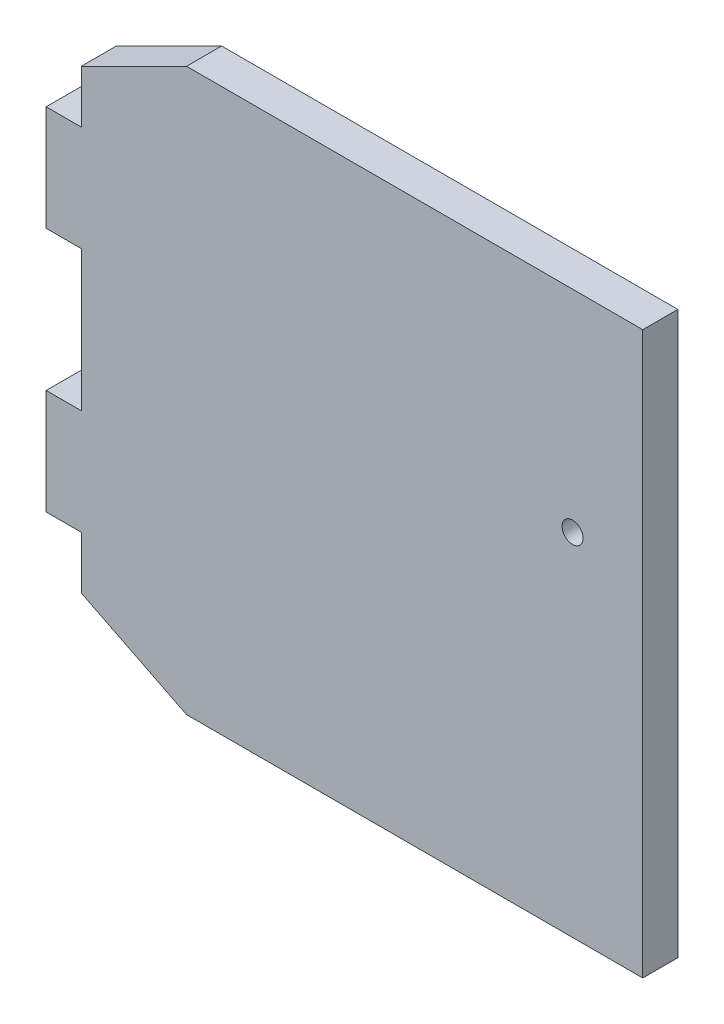
ISO-10303-21;
HEADER;
FILE_DESCRIPTION(('STEP AP214'),'2;1');
FILE_NAME('part.step','',(''),(''),'','','');
FILE_SCHEMA(('AUTOMOTIVE_DESIGN { 1 0 10303 214 1 1 1 1 }'));
ENDSEC;
DATA;
#1=APPLICATION_CONTEXT('core data for automotive mechanical design processes');
#2=APPLICATION_PROTOCOL_DEFINITION('international standard','automotive_design',2000,#1);
#3=PRODUCT_CONTEXT('',#1,'mechanical');
#4=PRODUCT('Part','Part','',(#3));
#5=PRODUCT_RELATED_PRODUCT_CATEGORY('part','',(#4));
#6=PRODUCT_DEFINITION_FORMATION('','',#4);
#7=PRODUCT_DEFINITION_CONTEXT('part definition',#1,'design');
#8=PRODUCT_DEFINITION('design','',#6,#7);
#9=PRODUCT_DEFINITION_SHAPE('','',#8);
#10=(LENGTH_UNIT() NAMED_UNIT(*) SI_UNIT(.MILLI.,.METRE.));
#11=(NAMED_UNIT(*) PLANE_ANGLE_UNIT() SI_UNIT($,.RADIAN.));
#12=(NAMED_UNIT(*) SI_UNIT($,.STERADIAN.) SOLID_ANGLE_UNIT());
#13=UNCERTAINTY_MEASURE_WITH_UNIT(LENGTH_MEASURE(1.E-05),#10,'distance_accuracy_value','');
#14=(GEOMETRIC_REPRESENTATION_CONTEXT(3) GLOBAL_UNCERTAINTY_ASSIGNED_CONTEXT((#13)) GLOBAL_UNIT_ASSIGNED_CONTEXT((#10,
#11,#12)) REPRESENTATION_CONTEXT('',''));
#15=CARTESIAN_POINT('',(0.,0.,0.));
#16=DIRECTION('',(0.,0.,1.));
#17=DIRECTION('',(1.,0.,0.));
#18=AXIS2_PLACEMENT_3D('',#15,#16,#17);
#19=CARTESIAN_POINT('',(-40.,31.7837837837838,5.));
#20=DIRECTION('',(1.,0.,0.));
#21=DIRECTION('',(0.,0.,-1.));
#22=AXIS2_PLACEMENT_3D('',#19,#20,#21);
#23=PLANE('',#22);
#24=DIRECTION('',(0.,-1.,0.));
#25=VECTOR('',#24,1.);
#26=CARTESIAN_POINT('',(-40.,31.7837837837838,0.));
#27=LINE('',#26,#25);
#28=CARTESIAN_POINT('',(-40.,-33.2162162162162,0.));
#29=VERTEX_POINT('',#28);
#30=CARTESIAN_POINT('',(-40.,-40.7162162162162,0.));
#31=VERTEX_POINT('',#30);
#32=EDGE_CURVE('E166',#29,#31,#27,.T.);
#33=ORIENTED_EDGE('',*,*,#32,.T.);
#34=DIRECTION('',(0.,0.,1.));
#35=VECTOR('',#34,1.);
#36=CARTESIAN_POINT('',(-40.,-40.7162162162162,0.));
#37=LINE('',#36,#35);
#38=CARTESIAN_POINT('',(-40.,-40.7162162162162,5.));
#39=VERTEX_POINT('',#38);
#40=EDGE_CURVE('E55',#31,#39,#37,.T.);
#41=ORIENTED_EDGE('',*,*,#40,.T.);
#42=DIRECTION('',(0.,-1.,0.));
#43=VECTOR('',#42,1.);
#44=CARTESIAN_POINT('',(-40.,31.7837837837838,5.));
#45=LINE('',#44,#43);
#46=CARTESIAN_POINT('',(-40.,-33.2162162162162,5.));
#47=VERTEX_POINT('',#46);
#48=EDGE_CURVE('E194',#47,#39,#45,.T.);
#49=ORIENTED_EDGE('',*,*,#48,.F.);
#50=DIRECTION('',(0.,0.,1.));
#51=VECTOR('',#50,1.);
#52=CARTESIAN_POINT('',(-40.,-33.2162162162162,0.));
#53=LINE('',#52,#51);
#54=EDGE_CURVE('E222',#29,#47,#53,.T.);
#55=ORIENTED_EDGE('',*,*,#54,.F.);
#56=EDGE_LOOP('',(#33,#41,#49,#55));
#57=FACE_BOUND('',#56,.T.);
#58=ADVANCED_FACE('F39',(#57),#23,.F.);
#59=DIRECTION('',(0.,0.,-1.));
#60=VECTOR('',#59,1.);
#61=CARTESIAN_POINT('',(-40.,-18.2162162162162,0.));
#62=LINE('',#61,#60);
#63=CARTESIAN_POINT('',(-40.,-18.2162162162162,5.));
#64=VERTEX_POINT('',#63);
#65=CARTESIAN_POINT('',(-40.,-18.2162162162162,0.));
#66=VERTEX_POINT('',#65);
#67=EDGE_CURVE('E226',#64,#66,#62,.T.);
#68=ORIENTED_EDGE('',*,*,#67,.F.);
#69=CARTESIAN_POINT('',(-40.,1.7837837837838,5.));
#70=VERTEX_POINT('',#69);
#71=EDGE_CURVE('E193',#70,#64,#45,.T.);
#72=ORIENTED_EDGE('',*,*,#71,.F.);
#73=DIRECTION('',(0.,0.,1.));
#74=VECTOR('',#73,1.);
#75=CARTESIAN_POINT('',(-40.,1.7837837837838,0.));
#76=LINE('',#75,#74);
#77=CARTESIAN_POINT('',(-40.,1.7837837837838,0.));
#78=VERTEX_POINT('',#77);
#79=EDGE_CURVE('E274',#78,#70,#76,.T.);
#80=ORIENTED_EDGE('',*,*,#79,.F.);
#81=EDGE_CURVE('E164',#78,#66,#27,.T.);
#82=ORIENTED_EDGE('',*,*,#81,.T.);
#83=EDGE_LOOP('',(#68,#72,#80,#82));
#84=FACE_BOUND('',#83,.T.);
#85=ADVANCED_FACE('F326',(#84),#23,.F.);
#86=CARTESIAN_POINT('',(-40.,24.2837837837838,5.));
#87=VERTEX_POINT('',#86);
#88=CARTESIAN_POINT('',(-40.,16.7837837837838,5.));
#89=VERTEX_POINT('',#88);
#90=EDGE_CURVE('E154',#87,#89,#45,.T.);
#91=ORIENTED_EDGE('',*,*,#90,.F.);
#92=DIRECTION('',(0.,0.,1.));
#93=VECTOR('',#92,1.);
#94=CARTESIAN_POINT('',(-40.,24.2837837837838,0.));
#95=LINE('',#94,#93);
#96=CARTESIAN_POINT('',(-40.,24.2837837837838,0.));
#97=VERTEX_POINT('',#96);
#98=EDGE_CURVE('E141',#97,#87,#95,.T.);
#99=ORIENTED_EDGE('',*,*,#98,.F.);
#100=CARTESIAN_POINT('',(-40.,16.7837837837838,0.));
#101=VERTEX_POINT('',#100);
#102=EDGE_CURVE('E152',#97,#101,#27,.T.);
#103=ORIENTED_EDGE('',*,*,#102,.T.);
#104=DIRECTION('',(0.,0.,-1.));
#105=VECTOR('',#104,1.);
#106=CARTESIAN_POINT('',(-40.,16.7837837837838,0.));
#107=LINE('',#106,#105);
#108=EDGE_CURVE('E280',#89,#101,#107,.T.);
#109=ORIENTED_EDGE('',*,*,#108,.F.);
#110=EDGE_LOOP('',(#91,#99,#103,#109));
#111=FACE_BOUND('',#110,.T.);
#112=ADVANCED_FACE('F41',(#111),#23,.F.);
#113=CARTESIAN_POINT('',(-40.,-48.2162162162162,5.));
#114=DIRECTION('',(0.,1.,0.));
#115=DIRECTION('',(0.,0.,1.));
#116=AXIS2_PLACEMENT_3D('',#113,#114,#115);
#117=PLANE('',#116);
#118=DIRECTION('',(1.,0.,0.));
#119=VECTOR('',#118,1.);
#120=CARTESIAN_POINT('',(-40.,-48.2162162162162,5.));
#121=LINE('',#120,#119);
#122=CARTESIAN_POINT('',(-25.,-48.2162162162162,5.));
#123=VERTEX_POINT('',#122);
#124=CARTESIAN_POINT('',(40.,-48.2162162162162,5.));
#125=VERTEX_POINT('',#124);
#126=EDGE_CURVE('E192',#123,#125,#121,.T.);
#127=ORIENTED_EDGE('',*,*,#126,.F.);
#128=DIRECTION('',(0.,0.,1.));
#129=VECTOR('',#128,1.);
#130=CARTESIAN_POINT('',(-25.,-48.2162162162162,0.));
#131=LINE('',#130,#129);
#132=CARTESIAN_POINT('',(-25.,-48.2162162162162,0.));
#133=VERTEX_POINT('',#132);
#134=EDGE_CURVE('E233',#133,#123,#131,.T.);
#135=ORIENTED_EDGE('',*,*,#134,.F.);
#136=DIRECTION('',(1.,0.,0.));
#137=VECTOR('',#136,1.);
#138=CARTESIAN_POINT('',(-40.,-48.2162162162162,0.));
#139=LINE('',#138,#137);
#140=CARTESIAN_POINT('',(40.,-48.2162162162162,0.));
#141=VERTEX_POINT('',#140);
#142=EDGE_CURVE('E163',#133,#141,#139,.T.);
#143=ORIENTED_EDGE('',*,*,#142,.T.);
#144=DIRECTION('',(0.,0.,-1.));
#145=VECTOR('',#144,1.);
#146=CARTESIAN_POINT('',(40.,-48.2162162162162,5.));
#147=LINE('',#146,#145);
#148=EDGE_CURVE('E11',#125,#141,#147,.T.);
#149=ORIENTED_EDGE('',*,*,#148,.F.);
#150=EDGE_LOOP('',(#127,#135,#143,#149));
#151=FACE_BOUND('',#150,.T.);
#152=ADVANCED_FACE('F332',(#151),#117,.F.);
#153=CARTESIAN_POINT('',(40.,21.7837837837838,5.));
#154=DIRECTION('',(-1.,0.,0.));
#155=DIRECTION('',(0.,-1.,0.));
#156=AXIS2_PLACEMENT_3D('',#153,#154,#155);
#157=PLANE('',#156);
#158=DIRECTION('',(0.,1.,0.));
#159=VECTOR('',#158,1.);
#160=CARTESIAN_POINT('',(40.,21.7837837837838,0.));
#161=LINE('',#160,#159);
#162=CARTESIAN_POINT('',(40.,31.7837837837838,0.));
#163=VERTEX_POINT('',#162);
#164=EDGE_CURVE('E169',#141,#163,#161,.T.);
#165=ORIENTED_EDGE('',*,*,#164,.T.);
#166=DIRECTION('',(0.,0.,-1.));
#167=VECTOR('',#166,1.);
#168=CARTESIAN_POINT('',(40.,31.7837837837838,5.));
#169=LINE('',#168,#167);
#170=CARTESIAN_POINT('',(40.,31.7837837837838,5.));
#171=VERTEX_POINT('',#170);
#172=EDGE_CURVE('E48',#171,#163,#169,.T.);
#173=ORIENTED_EDGE('',*,*,#172,.F.);
#174=DIRECTION('',(0.,1.,0.));
#175=VECTOR('',#174,1.);
#176=CARTESIAN_POINT('',(40.,21.7837837837838,5.));
#177=LINE('',#176,#175);
#178=EDGE_CURVE('E197',#125,#171,#177,.T.);
#179=ORIENTED_EDGE('',*,*,#178,.F.);
#180=ORIENTED_EDGE('',*,*,#148,.T.);
#181=EDGE_LOOP('',(#165,#173,#179,#180));
#182=FACE_BOUND('',#181,.T.);
#183=ADVANCED_FACE('F216',(#182),#157,.F.);
#184=CARTESIAN_POINT('',(-40.,31.7837837837838,5.));
#185=DIRECTION('',(0.,-1.,0.));
#186=DIRECTION('',(0.,0.,-1.));
#187=AXIS2_PLACEMENT_3D('',#184,#185,#186);
#188=PLANE('',#187);
#189=DIRECTION('',(-1.,0.,0.));
#190=VECTOR('',#189,1.);
#191=CARTESIAN_POINT('',(-40.,31.7837837837838,0.));
#192=LINE('',#191,#190);
#193=CARTESIAN_POINT('',(-25.,31.7837837837838,0.));
#194=VERTEX_POINT('',#193);
#195=EDGE_CURVE('E209',#163,#194,#192,.T.);
#196=ORIENTED_EDGE('',*,*,#195,.T.);
#197=DIRECTION('',(0.,0.,1.));
#198=VECTOR('',#197,1.);
#199=CARTESIAN_POINT('',(-25.,31.7837837837838,0.));
#200=LINE('',#199,#198);
#201=CARTESIAN_POINT('',(-25.,31.7837837837838,5.));
#202=VERTEX_POINT('',#201);
#203=EDGE_CURVE('E63',#194,#202,#200,.T.);
#204=ORIENTED_EDGE('',*,*,#203,.T.);
#205=DIRECTION('',(-1.,0.,0.));
#206=VECTOR('',#205,1.);
#207=CARTESIAN_POINT('',(40.,31.7837837837838,5.));
#208=LINE('',#207,#206);
#209=EDGE_CURVE('E199',#171,#202,#208,.T.);
#210=ORIENTED_EDGE('',*,*,#209,.F.);
#211=ORIENTED_EDGE('',*,*,#172,.T.);
#212=EDGE_LOOP('',(#196,#204,#210,#211));
#213=FACE_BOUND('',#212,.T.);
#214=ADVANCED_FACE('F220',(#213),#188,.F.);
#215=CARTESIAN_POINT('',(0.,0.,5.));
#216=DIRECTION('',(0.,0.,1.));
#217=DIRECTION('',(1.,0.,0.));
#218=AXIS2_PLACEMENT_3D('',#215,#216,#217);
#219=PLANE('',#218);
#220=CARTESIAN_POINT('',(30.,1.7837837837838,5.));
#221=DIRECTION('',(0.,0.,1.));
#222=DIRECTION('',(1.,0.,0.));
#223=AXIS2_PLACEMENT_3D('',#220,#221,#222);
#224=CIRCLE('',#223,1.5);
#225=CARTESIAN_POINT('',(31.5,1.7837837837838,5.));
#226=VERTEX_POINT('',#225);
#227=EDGE_CURVE('E306',#226,#226,#224,.T.);
#228=ORIENTED_EDGE('',*,*,#227,.F.);
#229=EDGE_LOOP('',(#228));
#230=FACE_BOUND('',#229,.T.);
#231=DIRECTION('',(0.894427190999916,0.447213595499958,0.));
#232=VECTOR('',#231,1.);
#233=CARTESIAN_POINT('',(-25.,31.7837837837838,5.));
#234=LINE('',#233,#232);
#235=EDGE_CURVE('E147',#87,#202,#234,.T.);
#236=ORIENTED_EDGE('',*,*,#235,.F.);
#237=ORIENTED_EDGE('',*,*,#90,.T.);
#238=DIRECTION('',(1.,0.,0.));
#239=VECTOR('',#238,1.);
#240=CARTESIAN_POINT('',(-45.,16.7837837837838,5.));
#241=LINE('',#240,#239);
#242=CARTESIAN_POINT('',(-45.,16.7837837837838,5.));
#243=VERTEX_POINT('',#242);
#244=EDGE_CURVE('E186',#243,#89,#241,.T.);
#245=ORIENTED_EDGE('',*,*,#244,.F.);
#246=DIRECTION('',(0.,1.,0.));
#247=VECTOR('',#246,1.);
#248=CARTESIAN_POINT('',(-45.,16.7837837837838,5.));
#249=LINE('',#248,#247);
#250=CARTESIAN_POINT('',(-45.,1.7837837837838,5.));
#251=VERTEX_POINT('',#250);
#252=EDGE_CURVE('E283',#251,#243,#249,.T.);
#253=ORIENTED_EDGE('',*,*,#252,.F.);
#254=DIRECTION('',(1.,0.,0.));
#255=VECTOR('',#254,1.);
#256=CARTESIAN_POINT('',(-45.,1.7837837837838,5.));
#257=LINE('',#256,#255);
#258=EDGE_CURVE('E179',#251,#70,#257,.T.);
#259=ORIENTED_EDGE('',*,*,#258,.T.);
#260=ORIENTED_EDGE('',*,*,#71,.T.);
#261=DIRECTION('',(1.,0.,0.));
#262=VECTOR('',#261,1.);
#263=CARTESIAN_POINT('',(-45.,-18.2162162162162,5.));
#264=LINE('',#263,#262);
#265=CARTESIAN_POINT('',(-45.,-18.2162162162162,5.));
#266=VERTEX_POINT('',#265);
#267=EDGE_CURVE('E262',#266,#64,#264,.T.);
#268=ORIENTED_EDGE('',*,*,#267,.F.);
#269=DIRECTION('',(0.,1.,0.));
#270=VECTOR('',#269,1.);
#271=CARTESIAN_POINT('',(-45.,-18.2162162162162,5.));
#272=LINE('',#271,#270);
#273=CARTESIAN_POINT('',(-45.,-33.2162162162162,5.));
#274=VERTEX_POINT('',#273);
#275=EDGE_CURVE('E249',#274,#266,#272,.T.);
#276=ORIENTED_EDGE('',*,*,#275,.F.);
#277=DIRECTION('',(1.,0.,0.));
#278=VECTOR('',#277,1.);
#279=CARTESIAN_POINT('',(-45.,-33.2162162162162,5.));
#280=LINE('',#279,#278);
#281=EDGE_CURVE('E266',#274,#47,#280,.T.);
#282=ORIENTED_EDGE('',*,*,#281,.T.);
#283=ORIENTED_EDGE('',*,*,#48,.T.);
#284=DIRECTION('',(-0.894427190999916,0.447213595499958,0.));
#285=VECTOR('',#284,1.);
#286=CARTESIAN_POINT('',(-40.,-40.7162162162162,5.));
#287=LINE('',#286,#285);
#288=EDGE_CURVE('E234',#123,#39,#287,.T.);
#289=ORIENTED_EDGE('',*,*,#288,.F.);
#290=ORIENTED_EDGE('',*,*,#126,.T.);
#291=ORIENTED_EDGE('',*,*,#178,.T.);
#292=ORIENTED_EDGE('',*,*,#209,.T.);
#293=EDGE_LOOP('',(#236,#237,#245,#253,#259,#260,#268,#276,#282,#283,#289,#290,#291,#292));
#294=FACE_BOUND('',#293,.T.);
#295=ADVANCED_FACE('F301',(#230,#294),#219,.T.);
#296=CARTESIAN_POINT('',(0.,0.,0.));
#297=DIRECTION('',(0.,0.,1.));
#298=DIRECTION('',(1.,0.,0.));
#299=AXIS2_PLACEMENT_3D('',#296,#297,#298);
#300=PLANE('',#299);
#301=CARTESIAN_POINT('',(30.,1.7837837837838,0.));
#302=DIRECTION('',(0.,0.,1.));
#303=DIRECTION('',(1.,0.,0.));
#304=AXIS2_PLACEMENT_3D('',#301,#302,#303);
#305=CIRCLE('',#304,1.5);
#306=CARTESIAN_POINT('',(31.5,1.7837837837838,0.));
#307=VERTEX_POINT('',#306);
#308=EDGE_CURVE('E237',#307,#307,#305,.T.);
#309=ORIENTED_EDGE('',*,*,#308,.T.);
#310=EDGE_LOOP('',(#309));
#311=FACE_BOUND('',#310,.T.);
#312=ORIENTED_EDGE('',*,*,#102,.F.);
#313=DIRECTION('',(0.894427190999916,0.447213595499958,0.));
#314=VECTOR('',#313,1.);
#315=CARTESIAN_POINT('',(-25.,31.7837837837838,0.));
#316=LINE('',#315,#314);
#317=EDGE_CURVE('E138',#97,#194,#316,.T.);
#318=ORIENTED_EDGE('',*,*,#317,.T.);
#319=ORIENTED_EDGE('',*,*,#195,.F.);
#320=ORIENTED_EDGE('',*,*,#164,.F.);
#321=ORIENTED_EDGE('',*,*,#142,.F.);
#322=DIRECTION('',(-0.894427190999916,0.447213595499958,0.));
#323=VECTOR('',#322,1.);
#324=CARTESIAN_POINT('',(-40.,-40.7162162162162,0.));
#325=LINE('',#324,#323);
#326=EDGE_CURVE('E230',#133,#31,#325,.T.);
#327=ORIENTED_EDGE('',*,*,#326,.T.);
#328=ORIENTED_EDGE('',*,*,#32,.F.);
#329=DIRECTION('',(1.,0.,0.));
#330=VECTOR('',#329,1.);
#331=CARTESIAN_POINT('',(-45.,-33.2162162162162,0.));
#332=LINE('',#331,#330);
#333=CARTESIAN_POINT('',(-45.,-33.2162162162162,0.));
#334=VERTEX_POINT('',#333);
#335=EDGE_CURVE('E270',#334,#29,#332,.T.);
#336=ORIENTED_EDGE('',*,*,#335,.F.);
#337=DIRECTION('',(0.,-1.,0.));
#338=VECTOR('',#337,1.);
#339=CARTESIAN_POINT('',(-45.,-18.2162162162162,0.));
#340=LINE('',#339,#338);
#341=CARTESIAN_POINT('',(-45.,-18.2162162162162,0.));
#342=VERTEX_POINT('',#341);
#343=EDGE_CURVE('E242',#342,#334,#340,.T.);
#344=ORIENTED_EDGE('',*,*,#343,.F.);
#345=DIRECTION('',(1.,0.,0.));
#346=VECTOR('',#345,1.);
#347=CARTESIAN_POINT('',(-45.,-18.2162162162162,0.));
#348=LINE('',#347,#346);
#349=EDGE_CURVE('E254',#342,#66,#348,.T.);
#350=ORIENTED_EDGE('',*,*,#349,.T.);
#351=ORIENTED_EDGE('',*,*,#81,.F.);
#352=DIRECTION('',(1.,0.,0.));
#353=VECTOR('',#352,1.);
#354=CARTESIAN_POINT('',(-45.,1.7837837837838,0.));
#355=LINE('',#354,#353);
#356=CARTESIAN_POINT('',(-45.,1.7837837837838,0.));
#357=VERTEX_POINT('',#356);
#358=EDGE_CURVE('E174',#357,#78,#355,.T.);
#359=ORIENTED_EDGE('',*,*,#358,.F.);
#360=DIRECTION('',(0.,-1.,0.));
#361=VECTOR('',#360,1.);
#362=CARTESIAN_POINT('',(-45.,16.7837837837838,0.));
#363=LINE('',#362,#361);
#364=CARTESIAN_POINT('',(-45.,16.7837837837838,0.));
#365=VERTEX_POINT('',#364);
#366=EDGE_CURVE('E275',#365,#357,#363,.T.);
#367=ORIENTED_EDGE('',*,*,#366,.F.);
#368=DIRECTION('',(1.,0.,0.));
#369=VECTOR('',#368,1.);
#370=CARTESIAN_POINT('',(-45.,16.7837837837838,0.));
#371=LINE('',#370,#369);
#372=EDGE_CURVE('E161',#365,#101,#371,.T.);
#373=ORIENTED_EDGE('',*,*,#372,.T.);
#374=EDGE_LOOP('',(#312,#318,#319,#320,#321,#327,#328,#336,#344,#350,#351,#359,#367,#373));
#375=FACE_BOUND('',#374,.T.);
#376=ADVANCED_FACE('F158',(#311,#375),#300,.F.);
#377=CARTESIAN_POINT('',(-45.,1.7837837837838,0.));
#378=DIRECTION('',(0.,1.,0.));
#379=DIRECTION('',(-1.,0.,0.));
#380=AXIS2_PLACEMENT_3D('',#377,#378,#379);
#381=PLANE('',#380);
#382=ORIENTED_EDGE('',*,*,#79,.T.);
#383=ORIENTED_EDGE('',*,*,#258,.F.);
#384=DIRECTION('',(0.,0.,1.));
#385=VECTOR('',#384,1.);
#386=CARTESIAN_POINT('',(-45.,1.7837837837838,0.));
#387=LINE('',#386,#385);
#388=EDGE_CURVE('E279',#357,#251,#387,.T.);
#389=ORIENTED_EDGE('',*,*,#388,.F.);
#390=ORIENTED_EDGE('',*,*,#358,.T.);
#391=EDGE_LOOP('',(#382,#383,#389,#390));
#392=FACE_BOUND('',#391,.T.);
#393=ADVANCED_FACE('F320',(#392),#381,.F.);
#394=CARTESIAN_POINT('',(-45.,16.7837837837838,0.));
#395=DIRECTION('',(0.,-1.,0.));
#396=DIRECTION('',(1.,0.,0.));
#397=AXIS2_PLACEMENT_3D('',#394,#395,#396);
#398=PLANE('',#397);
#399=ORIENTED_EDGE('',*,*,#108,.T.);
#400=ORIENTED_EDGE('',*,*,#372,.F.);
#401=DIRECTION('',(0.,0.,-1.));
#402=VECTOR('',#401,1.);
#403=CARTESIAN_POINT('',(-45.,16.7837837837838,0.));
#404=LINE('',#403,#402);
#405=EDGE_CURVE('E286',#243,#365,#404,.T.);
#406=ORIENTED_EDGE('',*,*,#405,.F.);
#407=ORIENTED_EDGE('',*,*,#244,.T.);
#408=EDGE_LOOP('',(#399,#400,#406,#407));
#409=FACE_BOUND('',#408,.T.);
#410=ADVANCED_FACE('F299',(#409),#398,.F.);
#411=CARTESIAN_POINT('',(-45.,0.,0.));
#412=DIRECTION('',(-1.,0.,0.));
#413=DIRECTION('',(0.,0.,1.));
#414=AXIS2_PLACEMENT_3D('',#411,#412,#413);
#415=PLANE('',#414);
#416=ORIENTED_EDGE('',*,*,#366,.T.);
#417=ORIENTED_EDGE('',*,*,#388,.T.);
#418=ORIENTED_EDGE('',*,*,#252,.T.);
#419=ORIENTED_EDGE('',*,*,#405,.T.);
#420=EDGE_LOOP('',(#416,#417,#418,#419));
#421=FACE_BOUND('',#420,.T.);
#422=ADVANCED_FACE('F365',(#421),#415,.T.);
#423=CARTESIAN_POINT('',(-45.,-33.2162162162162,0.));
#424=DIRECTION('',(0.,1.,0.));
#425=DIRECTION('',(-1.,0.,0.));
#426=AXIS2_PLACEMENT_3D('',#423,#424,#425);
#427=PLANE('',#426);
#428=ORIENTED_EDGE('',*,*,#54,.T.);
#429=ORIENTED_EDGE('',*,*,#281,.F.);
#430=DIRECTION('',(0.,0.,1.));
#431=VECTOR('',#430,1.);
#432=CARTESIAN_POINT('',(-45.,-33.2162162162162,0.));
#433=LINE('',#432,#431);
#434=EDGE_CURVE('E246',#334,#274,#433,.T.);
#435=ORIENTED_EDGE('',*,*,#434,.F.);
#436=ORIENTED_EDGE('',*,*,#335,.T.);
#437=EDGE_LOOP('',(#428,#429,#435,#436));
#438=FACE_BOUND('',#437,.T.);
#439=ADVANCED_FACE('F349',(#438),#427,.F.);
#440=CARTESIAN_POINT('',(-45.,-18.2162162162162,0.));
#441=DIRECTION('',(0.,-1.,0.));
#442=DIRECTION('',(1.,0.,0.));
#443=AXIS2_PLACEMENT_3D('',#440,#441,#442);
#444=PLANE('',#443);
#445=ORIENTED_EDGE('',*,*,#67,.T.);
#446=ORIENTED_EDGE('',*,*,#349,.F.);
#447=DIRECTION('',(0.,0.,-1.));
#448=VECTOR('',#447,1.);
#449=CARTESIAN_POINT('',(-45.,-18.2162162162162,0.));
#450=LINE('',#449,#448);
#451=EDGE_CURVE('E252',#266,#342,#450,.T.);
#452=ORIENTED_EDGE('',*,*,#451,.F.);
#453=ORIENTED_EDGE('',*,*,#267,.T.);
#454=EDGE_LOOP('',(#445,#446,#452,#453));
#455=FACE_BOUND('',#454,.T.);
#456=ADVANCED_FACE('F361',(#455),#444,.F.);
#457=CARTESIAN_POINT('',(-45.,0.,0.));
#458=DIRECTION('',(-1.,0.,0.));
#459=DIRECTION('',(0.,-1.,0.));
#460=AXIS2_PLACEMENT_3D('',#457,#458,#459);
#461=PLANE('',#460);
#462=ORIENTED_EDGE('',*,*,#343,.T.);
#463=ORIENTED_EDGE('',*,*,#434,.T.);
#464=ORIENTED_EDGE('',*,*,#275,.T.);
#465=ORIENTED_EDGE('',*,*,#451,.T.);
#466=EDGE_LOOP('',(#462,#463,#464,#465));
#467=FACE_BOUND('',#466,.T.);
#468=ADVANCED_FACE('F356',(#467),#461,.T.);
#469=CARTESIAN_POINT('',(-40.,-40.7162162162162,0.));
#470=DIRECTION('',(0.447213595499958,0.894427190999916,0.));
#471=DIRECTION('',(-0.894427190999916,0.447213595499958,0.));
#472=AXIS2_PLACEMENT_3D('',#469,#470,#471);
#473=PLANE('',#472);
#474=ORIENTED_EDGE('',*,*,#288,.T.);
#475=ORIENTED_EDGE('',*,*,#40,.F.);
#476=ORIENTED_EDGE('',*,*,#326,.F.);
#477=ORIENTED_EDGE('',*,*,#134,.T.);
#478=EDGE_LOOP('',(#474,#475,#476,#477));
#479=FACE_BOUND('',#478,.T.);
#480=ADVANCED_FACE('F345',(#479),#473,.F.);
#481=CARTESIAN_POINT('',(-25.,31.7837837837838,0.));
#482=DIRECTION('',(0.447213595499958,-0.894427190999916,0.));
#483=DIRECTION('',(0.894427190999916,0.447213595499958,0.));
#484=AXIS2_PLACEMENT_3D('',#481,#482,#483);
#485=PLANE('',#484);
#486=ORIENTED_EDGE('',*,*,#235,.T.);
#487=ORIENTED_EDGE('',*,*,#203,.F.);
#488=ORIENTED_EDGE('',*,*,#317,.F.);
#489=ORIENTED_EDGE('',*,*,#98,.T.);
#490=EDGE_LOOP('',(#486,#487,#488,#489));
#491=FACE_BOUND('',#490,.T.);
#492=ADVANCED_FACE('F140',(#491),#485,.F.);
#493=CARTESIAN_POINT('',(30.,1.7837837837838,0.));
#494=DIRECTION('',(0.,0.,1.));
#495=DIRECTION('',(1.,0.,0.));
#496=AXIS2_PLACEMENT_3D('',#493,#494,#495);
#497=CYLINDRICAL_SURFACE('',#496,1.5);
#498=ORIENTED_EDGE('',*,*,#308,.F.);
#499=EDGE_LOOP('',(#498));
#500=FACE_BOUND('',#499,.T.);
#501=ORIENTED_EDGE('',*,*,#227,.T.);
#502=EDGE_LOOP('',(#501));
#503=FACE_BOUND('',#502,.T.);
#504=ADVANCED_FACE('F312',(#500,#503),#497,.F.);
#505=CLOSED_SHELL('',(#58,#85,#112,#152,#183,#214,#295,#376,#393,#410,#422,#439,#456,#468,#480,
#492,#504));
#506=MANIFOLD_SOLID_BREP('B2',#505);
#507=ADVANCED_BREP_SHAPE_REPRESENTATION('',(#18,#506),#14);
#508=SHAPE_DEFINITION_REPRESENTATION(#9,#507);
ENDSEC;
END-ISO-10303-21;
